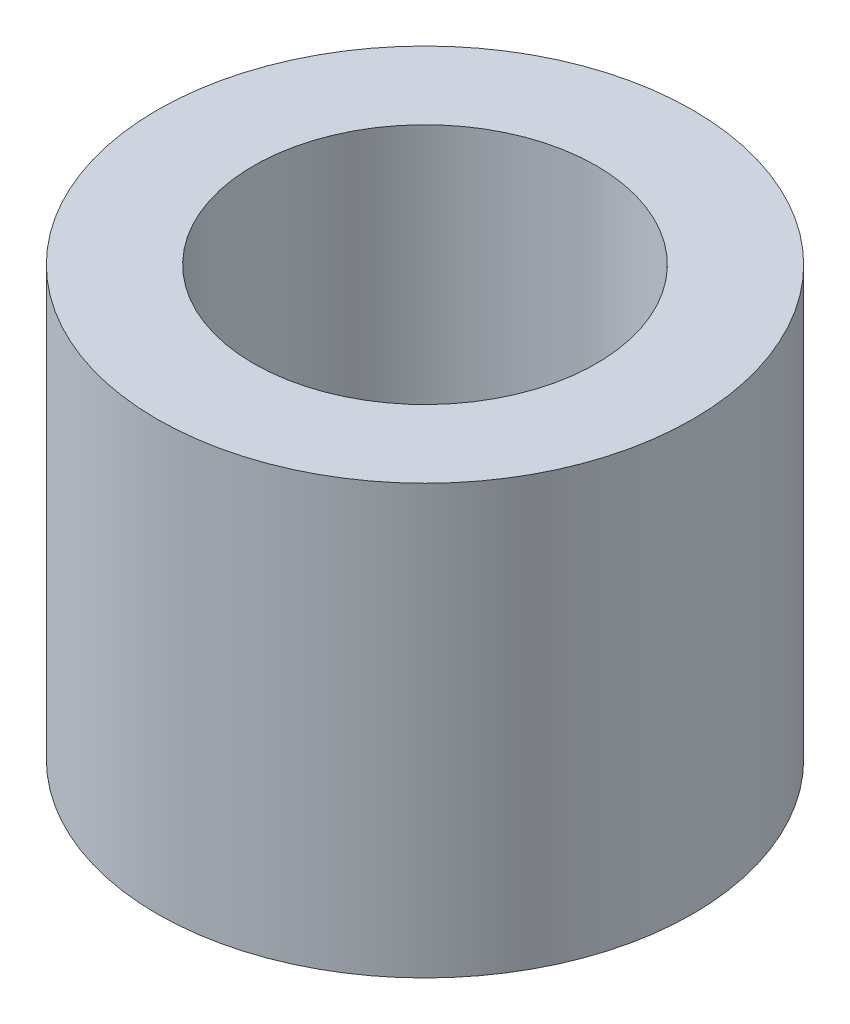
ISO-10303-21;
HEADER;
FILE_DESCRIPTION(('STEP AP214'),'2;1');
FILE_NAME('part.step','',(''),(''),'','','');
FILE_SCHEMA(('AUTOMOTIVE_DESIGN { 1 0 10303 214 1 1 1 1 }'));
ENDSEC;
DATA;
#1=APPLICATION_CONTEXT('core data for automotive mechanical design processes');
#2=APPLICATION_PROTOCOL_DEFINITION('international standard','automotive_design',2000,#1);
#3=PRODUCT_CONTEXT('',#1,'mechanical');
#4=PRODUCT('Part','Part','',(#3));
#5=PRODUCT_RELATED_PRODUCT_CATEGORY('part','',(#4));
#6=PRODUCT_DEFINITION_FORMATION('','',#4);
#7=PRODUCT_DEFINITION_CONTEXT('part definition',#1,'design');
#8=PRODUCT_DEFINITION('design','',#6,#7);
#9=PRODUCT_DEFINITION_SHAPE('','',#8);
#10=(LENGTH_UNIT() NAMED_UNIT(*) SI_UNIT(.MILLI.,.METRE.));
#11=(NAMED_UNIT(*) PLANE_ANGLE_UNIT() SI_UNIT($,.RADIAN.));
#12=(NAMED_UNIT(*) SI_UNIT($,.STERADIAN.) SOLID_ANGLE_UNIT());
#13=UNCERTAINTY_MEASURE_WITH_UNIT(LENGTH_MEASURE(1.E-05),#10,'distance_accuracy_value','');
#14=(GEOMETRIC_REPRESENTATION_CONTEXT(3) GLOBAL_UNCERTAINTY_ASSIGNED_CONTEXT((#13)) GLOBAL_UNIT_ASSIGNED_CONTEXT((#10,
#11,#12)) REPRESENTATION_CONTEXT('',''));
#15=CARTESIAN_POINT('',(0.,0.,0.));
#16=DIRECTION('',(0.,0.,1.));
#17=DIRECTION('',(1.,0.,0.));
#18=AXIS2_PLACEMENT_3D('',#15,#16,#17);
#19=CARTESIAN_POINT('',(0.,5.08,0.));
#20=DIRECTION('',(0.,-1.,0.));
#21=DIRECTION('',(0.,0.,-1.));
#22=AXIS2_PLACEMENT_3D('',#19,#20,#21);
#23=CYLINDRICAL_SURFACE('',#22,3.175);
#24=CARTESIAN_POINT('',(0.,5.08,0.));
#25=DIRECTION('',(0.,1.,0.));
#26=DIRECTION('',(0.,0.,1.));
#27=AXIS2_PLACEMENT_3D('',#24,#25,#26);
#28=CIRCLE('',#27,3.175);
#29=CARTESIAN_POINT('',(0.,5.08,3.175));
#30=VERTEX_POINT('',#29);
#31=EDGE_CURVE('E10',#30,#30,#28,.T.);
#32=ORIENTED_EDGE('',*,*,#31,.F.);
#33=EDGE_LOOP('',(#32));
#34=FACE_BOUND('',#33,.T.);
#35=CARTESIAN_POINT('',(0.,0.,0.));
#36=DIRECTION('',(0.,1.,0.));
#37=DIRECTION('',(0.,0.,1.));
#38=AXIS2_PLACEMENT_3D('',#35,#36,#37);
#39=CIRCLE('',#38,3.175);
#40=CARTESIAN_POINT('',(0.,0.,3.175));
#41=VERTEX_POINT('',#40);
#42=EDGE_CURVE('E37',#41,#41,#39,.T.);
#43=ORIENTED_EDGE('',*,*,#42,.T.);
#44=EDGE_LOOP('',(#43));
#45=FACE_BOUND('',#44,.T.);
#46=ADVANCED_FACE('F34',(#34,#45),#23,.T.);
#47=CARTESIAN_POINT('',(0.,5.08,0.));
#48=DIRECTION('',(0.,1.,0.));
#49=DIRECTION('',(0.,0.,1.));
#50=AXIS2_PLACEMENT_3D('',#47,#48,#49);
#51=PLANE('',#50);
#52=CARTESIAN_POINT('',(0.,5.08,0.));
#53=DIRECTION('',(0.,1.,0.));
#54=DIRECTION('',(0.,0.,1.));
#55=AXIS2_PLACEMENT_3D('',#52,#53,#54);
#56=CIRCLE('',#55,2.032);
#57=CARTESIAN_POINT('',(0.,5.08,2.032));
#58=VERTEX_POINT('',#57);
#59=EDGE_CURVE('E46',#58,#58,#56,.T.);
#60=ORIENTED_EDGE('',*,*,#59,.F.);
#61=EDGE_LOOP('',(#60));
#62=FACE_BOUND('',#61,.T.);
#63=ORIENTED_EDGE('',*,*,#31,.T.);
#64=EDGE_LOOP('',(#63));
#65=FACE_BOUND('',#64,.T.);
#66=ADVANCED_FACE('F61',(#62,#65),#51,.T.);
#67=CARTESIAN_POINT('',(0.,0.,0.));
#68=DIRECTION('',(0.,1.,0.));
#69=DIRECTION('',(0.,0.,1.));
#70=AXIS2_PLACEMENT_3D('',#67,#68,#69);
#71=PLANE('',#70);
#72=CARTESIAN_POINT('',(0.,0.,0.));
#73=DIRECTION('',(0.,1.,0.));
#74=DIRECTION('',(0.,0.,1.));
#75=AXIS2_PLACEMENT_3D('',#72,#73,#74);
#76=CIRCLE('',#75,2.032);
#77=CARTESIAN_POINT('',(0.,0.,2.032));
#78=VERTEX_POINT('',#77);
#79=EDGE_CURVE('E44',#78,#78,#76,.T.);
#80=ORIENTED_EDGE('',*,*,#79,.T.);
#81=EDGE_LOOP('',(#80));
#82=FACE_BOUND('',#81,.T.);
#83=ORIENTED_EDGE('',*,*,#42,.F.);
#84=EDGE_LOOP('',(#83));
#85=FACE_BOUND('',#84,.T.);
#86=ADVANCED_FACE('F52',(#82,#85),#71,.F.);
#87=CARTESIAN_POINT('',(0.,0.,0.));
#88=DIRECTION('',(0.,1.,0.));
#89=DIRECTION('',(0.,0.,1.));
#90=AXIS2_PLACEMENT_3D('',#87,#88,#89);
#91=CYLINDRICAL_SURFACE('',#90,2.032);
#92=ORIENTED_EDGE('',*,*,#79,.F.);
#93=EDGE_LOOP('',(#92));
#94=FACE_BOUND('',#93,.T.);
#95=ORIENTED_EDGE('',*,*,#59,.T.);
#96=EDGE_LOOP('',(#95));
#97=FACE_BOUND('',#96,.T.);
#98=ADVANCED_FACE('F55',(#94,#97),#91,.F.);
#99=CLOSED_SHELL('',(#46,#66,#86,#98));
#100=MANIFOLD_SOLID_BREP('B2',#99);
#101=ADVANCED_BREP_SHAPE_REPRESENTATION('',(#18,#100),#14);
#102=SHAPE_DEFINITION_REPRESENTATION(#9,#101);
ENDSEC;
END-ISO-10303-21;
